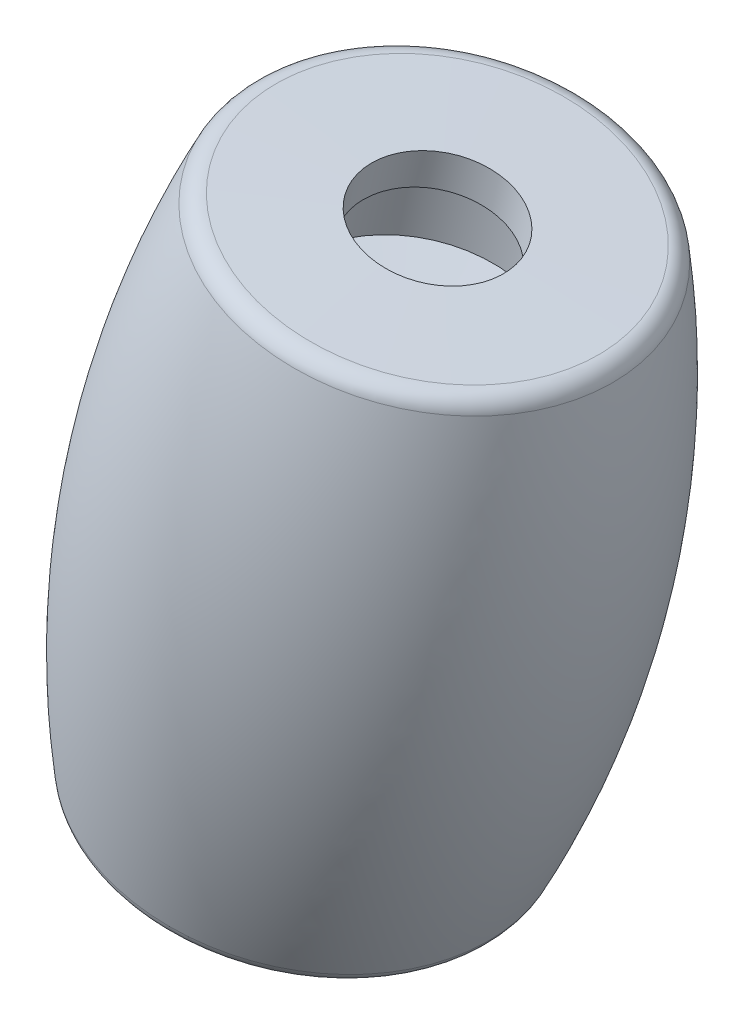
ISO-10303-21;
HEADER;
FILE_DESCRIPTION(('STEP AP214'),'2;1');
FILE_NAME('part.step','',(''),(''),'','','');
FILE_SCHEMA(('AUTOMOTIVE_DESIGN { 1 0 10303 214 1 1 1 1 }'));
ENDSEC;
DATA;
#1=APPLICATION_CONTEXT('core data for automotive mechanical design processes');
#2=APPLICATION_PROTOCOL_DEFINITION('international standard','automotive_design',2000,#1);
#3=PRODUCT_CONTEXT('',#1,'mechanical');
#4=PRODUCT('Part','Part','',(#3));
#5=PRODUCT_RELATED_PRODUCT_CATEGORY('part','',(#4));
#6=PRODUCT_DEFINITION_FORMATION('','',#4);
#7=PRODUCT_DEFINITION_CONTEXT('part definition',#1,'design');
#8=PRODUCT_DEFINITION('design','',#6,#7);
#9=PRODUCT_DEFINITION_SHAPE('','',#8);
#10=(LENGTH_UNIT() NAMED_UNIT(*) SI_UNIT(.MILLI.,.METRE.));
#11=(NAMED_UNIT(*) PLANE_ANGLE_UNIT() SI_UNIT($,.RADIAN.));
#12=(NAMED_UNIT(*) SI_UNIT($,.STERADIAN.) SOLID_ANGLE_UNIT());
#13=UNCERTAINTY_MEASURE_WITH_UNIT(LENGTH_MEASURE(1.E-05),#10,'distance_accuracy_value','');
#14=(GEOMETRIC_REPRESENTATION_CONTEXT(3) GLOBAL_UNCERTAINTY_ASSIGNED_CONTEXT((#13)) GLOBAL_UNIT_ASSIGNED_CONTEXT((#10,
#11,#12)) REPRESENTATION_CONTEXT('',''));
#15=CARTESIAN_POINT('',(0.,0.,0.));
#16=DIRECTION('',(0.,0.,1.));
#17=DIRECTION('',(1.,0.,0.));
#18=AXIS2_PLACEMENT_3D('',#15,#16,#17);
#19=CARTESIAN_POINT('',(23.5095303593453,-4.85303845884583,0.));
#20=DIRECTION('',(-0.222520933956315,-0.974927912181824,0.));
#21=DIRECTION('',(0.974927912181824,-0.222520933956315,0.));
#22=AXIS2_PLACEMENT_3D('',#19,#20,#21);
#23=CONICAL_SURFACE('',#22,4.5000000001628,1.48352986420494);
#24=CARTESIAN_POINT('',(23.509530359342,-4.85303845886061,0.));
#25=DIRECTION('',(0.222520933956315,0.974927912181824,0.));
#26=DIRECTION('',(-0.974927912181824,0.222520933956315,0.));
#27=AXIS2_PLACEMENT_3D('',#24,#25,#26);
#28=CIRCLE('',#27,4.5);
#29=CARTESIAN_POINT('',(19.1223547545237,-3.85169425605719,0.));
#30=VERTEX_POINT('',#29);
#31=EDGE_CURVE('E20',#30,#30,#28,.F.);
#32=ORIENTED_EDGE('',*,*,#31,.T.);
#33=EDGE_LOOP('',(#32));
#34=FACE_BOUND('',#33,.T.);
#35=CARTESIAN_POINT('',(23.5387324480195,-4.72509574875425,0.));
#36=DIRECTION('',(0.222520933956315,0.974927912181824,0.));
#37=DIRECTION('',(-0.974927912181824,0.222520933956315,0.));
#38=AXIS2_PLACEMENT_3D('',#35,#36,#37);
#39=CIRCLE('',#38,3.);
#40=CARTESIAN_POINT('',(20.6139487114741,-4.0575329468853,0.));
#41=VERTEX_POINT('',#40);
#42=EDGE_CURVE('E108',#41,#41,#39,.T.);
#43=ORIENTED_EDGE('',*,*,#42,.T.);
#44=EDGE_LOOP('',(#43));
#45=FACE_BOUND('',#44,.T.);
#46=ADVANCED_FACE('F16',(#34,#45),#23,.F.);
#47=CARTESIAN_POINT('',(23.3982698923638,-5.34050241495152,0.));
#48=DIRECTION('',(0.222520933956315,0.974927912181824,0.));
#49=DIRECTION('',(-0.974927912181824,0.222520933956315,0.));
#50=AXIS2_PLACEMENT_3D('',#47,#48,#49);
#51=CYLINDRICAL_SURFACE('',#50,4.5);
#52=CARTESIAN_POINT('',(23.2870094253812,-5.82796637106183,0.));
#53=DIRECTION('',(0.222520933956315,0.974927912181824,0.));
#54=DIRECTION('',(0.783683266604705,-0.178870591591281,0.594849433981041));
#55=AXIS2_PLACEMENT_3D('',#52,#53,#54);
#56=CIRCLE('',#55,4.50000000004347);
#57=CARTESIAN_POINT('',(26.8135841251365,-6.63288403323037,2.67682245294054));
#58=VERTEX_POINT('',#57);
#59=EDGE_CURVE('E106',#58,#58,#56,.F.);
#60=ORIENTED_EDGE('',*,*,#59,.T.);
#61=EDGE_LOOP('',(#60));
#62=FACE_BOUND('',#61,.T.);
#63=ORIENTED_EDGE('',*,*,#31,.F.);
#64=EDGE_LOOP('',(#63));
#65=FACE_BOUND('',#64,.T.);
#66=ADVANCED_FACE('F116',(#62,#65),#51,.F.);
#67=CARTESIAN_POINT('',(23.8544378069742,-3.34190019497878,0.));
#68=DIRECTION('',(0.222520933956315,0.974927912181824,0.));
#69=DIRECTION('',(-0.974927912181824,0.222520933956315,0.));
#70=AXIS2_PLACEMENT_3D('',#67,#68,#69);
#71=CYLINDRICAL_SURFACE('',#70,3.);
#72=ORIENTED_EDGE('',*,*,#42,.F.);
#73=EDGE_LOOP('',(#72));
#74=FACE_BOUND('',#73,.T.);
#75=CARTESIAN_POINT('',(24.1701431659303,-1.95870464119732,0.));
#76=DIRECTION('',(0.222520933956315,0.974927912181824,0.));
#77=DIRECTION('',(0.783683266610111,-0.178870591592515,0.594849433973547));
#78=AXIS2_PLACEMENT_3D('',#75,#76,#77);
#79=CIRCLE('',#78,3.00000000003492);
#80=CARTESIAN_POINT('',(26.521192965788,-2.49531641598111,1.78454830194141));
#81=VERTEX_POINT('',#80);
#82=EDGE_CURVE('E103',#81,#81,#79,.T.);
#83=ORIENTED_EDGE('',*,*,#82,.T.);
#84=EDGE_LOOP('',(#83));
#85=FACE_BOUND('',#84,.T.);
#86=ADVANCED_FACE('F118',(#74,#85),#71,.F.);
#87=CARTESIAN_POINT('',(23.2870094253812,-5.82796637106183,0.));
#88=DIRECTION('',(0.222520933956315,0.974927912181824,0.));
#89=DIRECTION('',(-0.974927912181824,0.222520933956315,0.));
#90=AXIS2_PLACEMENT_3D('',#87,#88,#89);
#91=CONICAL_SURFACE('',#90,4.50000000004348,1.48352986421022);
#92=ORIENTED_EDGE('',*,*,#59,.F.);
#93=EDGE_LOOP('',(#92));
#94=FACE_BOUND('',#93,.T.);
#95=CARTESIAN_POINT('',(23.2578073367081,-5.95590908114879,0.));
#96=DIRECTION('',(0.222520933956315,0.974927912181824,0.));
#97=DIRECTION('',(-0.974927912181824,0.222520933956315,0.));
#98=AXIS2_PLACEMENT_3D('',#95,#96,#97);
#99=CIRCLE('',#98,3.);
#100=CARTESIAN_POINT('',(20.3330236001626,-5.28834627927985,0.));
#101=VERTEX_POINT('',#100);
#102=EDGE_CURVE('E100',#101,#101,#99,.F.);
#103=ORIENTED_EDGE('',*,*,#102,.T.);
#104=EDGE_LOOP('',(#103));
#105=FACE_BOUND('',#104,.T.);
#106=ADVANCED_FACE('F126',(#94,#105),#91,.F.);
#107=CARTESIAN_POINT('',(24.1993452546095,-1.830761931084,0.));
#108=DIRECTION('',(0.222520933956315,0.974927912181824,0.));
#109=DIRECTION('',(-0.974927912181824,0.222520933956315,0.));
#110=AXIS2_PLACEMENT_3D('',#107,#108,#109);
#111=CONICAL_SURFACE('',#110,4.50000000006729,1.48352986419233);
#112=CARTESIAN_POINT('',(24.1993452546065,-1.83076193109696,0.));
#113=DIRECTION('',(0.222520933956315,0.974927912181824,0.));
#114=DIRECTION('',(-0.974927912181824,0.222520933956315,0.));
#115=AXIS2_PLACEMENT_3D('',#112,#113,#114);
#116=CIRCLE('',#115,4.5);
#117=CARTESIAN_POINT('',(19.8121696497883,-0.829417728293538,0.));
#118=VERTEX_POINT('',#117);
#119=EDGE_CURVE('E97',#118,#118,#116,.T.);
#120=ORIENTED_EDGE('',*,*,#119,.T.);
#121=EDGE_LOOP('',(#120));
#122=FACE_BOUND('',#121,.T.);
#123=ORIENTED_EDGE('',*,*,#82,.F.);
#124=EDGE_LOOP('',(#123));
#125=FACE_BOUND('',#124,.T.);
#126=ADVANCED_FACE('F219',(#122,#125),#111,.F.);
#127=CARTESIAN_POINT('',(22.9421019777534,-7.33910463492426,0.));
#128=DIRECTION('',(0.222520933956315,0.974927912181824,0.));
#129=DIRECTION('',(-0.974927912181824,0.222520933956315,0.));
#130=AXIS2_PLACEMENT_3D('',#127,#128,#129);
#131=CYLINDRICAL_SURFACE('',#130,3.);
#132=ORIENTED_EDGE('',*,*,#102,.F.);
#133=EDGE_LOOP('',(#132));
#134=FACE_BOUND('',#133,.T.);
#135=CARTESIAN_POINT('',(22.6263966187988,-8.72230018869918,0.));
#136=DIRECTION('',(-0.222520933956315,-0.974927912181824,0.));
#137=DIRECTION('',(-0.783683266609235,0.178870591592315,-0.594849433974761));
#138=AXIS2_PLACEMENT_3D('',#135,#136,#137);
#139=CIRCLE('',#138,3.00000000002879);
#140=CARTESIAN_POINT('',(20.2753468189485,-8.18568841391709,-1.78454830194141));
#141=VERTEX_POINT('',#140);
#142=EDGE_CURVE('E94',#141,#141,#139,.T.);
#143=ORIENTED_EDGE('',*,*,#142,.T.);
#144=EDGE_LOOP('',(#143));
#145=FACE_BOUND('',#144,.T.);
#146=ADVANCED_FACE('F215',(#134,#145),#131,.F.);
#147=CARTESIAN_POINT('',(24.3106057215847,-1.34329797500605,0.));
#148=DIRECTION('',(0.222520933956315,0.974927912181824,0.));
#149=DIRECTION('',(-0.974927912181824,0.222520933956315,0.));
#150=AXIS2_PLACEMENT_3D('',#147,#148,#149);
#151=CYLINDRICAL_SURFACE('',#150,4.5);
#152=CARTESIAN_POINT('',(24.4218661885656,-0.855834018902945,0.));
#153=DIRECTION('',(-0.222520933956315,-0.974927912181824,0.));
#154=DIRECTION('',(-0.783683266614044,0.178870591593412,-0.594849433968095));
#155=AXIS2_PLACEMENT_3D('',#152,#153,#154);
#156=CIRCLE('',#155,4.49999999995028);
#157=CARTESIAN_POINT('',(20.8952914888414,-0.0509163567414816,-2.67682245282685));
#158=VERTEX_POINT('',#157);
#159=EDGE_CURVE('E91',#158,#158,#156,.F.);
#160=ORIENTED_EDGE('',*,*,#159,.T.);
#161=EDGE_LOOP('',(#160));
#162=FACE_BOUND('',#161,.T.);
#163=ORIENTED_EDGE('',*,*,#119,.F.);
#164=EDGE_LOOP('',(#163));
#165=FACE_BOUND('',#164,.T.);
#166=ADVANCED_FACE('F211',(#162,#165),#151,.F.);
#167=CARTESIAN_POINT('',(22.5971945301221,-8.85024289880135,0.));
#168=DIRECTION('',(-0.222520933956315,-0.974927912181824,0.));
#169=DIRECTION('',(0.974927912181824,-0.222520933956315,0.));
#170=AXIS2_PLACEMENT_3D('',#167,#168,#169);
#171=CONICAL_SURFACE('',#170,4.49999999993571,1.48352986419233);
#172=ORIENTED_EDGE('',*,*,#142,.F.);
#173=EDGE_LOOP('',(#172));
#174=FACE_BOUND('',#173,.T.);
#175=CARTESIAN_POINT('',(22.5971945301211,-8.85024289880609,0.));
#176=DIRECTION('',(0.222520933956315,0.974927912181824,0.));
#177=DIRECTION('',(-0.974927912181824,0.222520933956315,0.));
#178=AXIS2_PLACEMENT_3D('',#175,#176,#177);
#179=CIRCLE('',#178,4.5);
#180=CARTESIAN_POINT('',(18.2100189253029,-7.84889869600267,0.));
#181=VERTEX_POINT('',#180);
#182=EDGE_CURVE('E88',#181,#181,#179,.F.);
#183=ORIENTED_EDGE('',*,*,#182,.T.);
#184=EDGE_LOOP('',(#183));
#185=FACE_BOUND('',#184,.T.);
#186=ADVANCED_FACE('F207',(#174,#185),#171,.F.);
#187=CARTESIAN_POINT('',(24.4218661885656,-0.855834018902945,0.));
#188=DIRECTION('',(-0.222520933956315,-0.974927912181824,0.));
#189=DIRECTION('',(0.974927912181824,-0.222520933956315,0.));
#190=AXIS2_PLACEMENT_3D('',#187,#188,#189);
#191=CONICAL_SURFACE('',#190,4.49999999995029,1.48352986419812);
#192=ORIENTED_EDGE('',*,*,#159,.F.);
#193=EDGE_LOOP('',(#192));
#194=FACE_BOUND('',#193,.T.);
#195=CARTESIAN_POINT('',(24.4510682772404,-0.727891308808778,0.));
#196=DIRECTION('',(0.222520933956315,0.974927912181824,0.));
#197=DIRECTION('',(-0.974927912181824,0.222520933956315,0.));
#198=AXIS2_PLACEMENT_3D('',#195,#196,#197);
#199=CIRCLE('',#198,3.);
#200=CARTESIAN_POINT('',(21.5262845406949,-0.0603285069398328,0.));
#201=VERTEX_POINT('',#200);
#202=EDGE_CURVE('E85',#201,#201,#199,.T.);
#203=ORIENTED_EDGE('',*,*,#202,.T.);
#204=EDGE_LOOP('',(#203));
#205=FACE_BOUND('',#204,.T.);
#206=ADVANCED_FACE('F203',(#194,#205),#191,.F.);
#207=CARTESIAN_POINT('',(22.4859340631429,-9.337706854897,0.));
#208=DIRECTION('',(0.222520933956315,0.974927912181824,0.));
#209=DIRECTION('',(-0.974927912181824,0.222520933956315,0.));
#210=AXIS2_PLACEMENT_3D('',#207,#208,#209);
#211=CYLINDRICAL_SURFACE('',#210,4.5);
#212=CARTESIAN_POINT('',(22.3746735961622,-9.82517081099914,0.));
#213=DIRECTION('',(0.222520933956315,0.974927912181824,0.));
#214=DIRECTION('',(0.78368326660437,-0.178870591591204,0.594849433981505));
#215=AXIS2_PLACEMENT_3D('',#212,#213,#214);
#216=CIRCLE('',#215,4.49999999994441);
#217=CARTESIAN_POINT('',(25.9012482958383,-10.6300884731496,2.6768224528837));
#218=VERTEX_POINT('',#217);
#219=EDGE_CURVE('E82',#218,#218,#216,.F.);
#220=ORIENTED_EDGE('',*,*,#219,.T.);
#221=EDGE_LOOP('',(#220));
#222=FACE_BOUND('',#221,.T.);
#223=ORIENTED_EDGE('',*,*,#182,.F.);
#224=EDGE_LOOP('',(#223));
#225=FACE_BOUND('',#224,.T.);
#226=ADVANCED_FACE('F199',(#222,#225),#211,.F.);
#227=CARTESIAN_POINT('',(24.6117730782903,-0.0237975708420879,0.));
#228=DIRECTION('',(0.222520933956315,0.974927912181824,0.));
#229=DIRECTION('',(-0.974927912181824,0.222520933956315,0.));
#230=AXIS2_PLACEMENT_3D('',#227,#228,#229);
#231=CYLINDRICAL_SURFACE('',#230,3.);
#232=ORIENTED_EDGE('',*,*,#202,.F.);
#233=EDGE_LOOP('',(#232));
#234=FACE_BOUND('',#233,.T.);
#235=CARTESIAN_POINT('',(24.7724778793409,0.680296167128091,0.));
#236=DIRECTION('',(0.222520933956315,0.974927912181824,0.));
#237=DIRECTION('',(0.783683266616735,-0.178870591594027,0.594849433964366));
#238=AXIS2_PLACEMENT_3D('',#235,#236,#237);
#239=CIRCLE('',#238,2.99999999998566);
#240=CARTESIAN_POINT('',(27.1235276791799,0.143684392348575,1.78454830188457));
#241=VERTEX_POINT('',#240);
#242=EDGE_CURVE('E79',#241,#241,#239,.T.);
#243=ORIENTED_EDGE('',*,*,#242,.T.);
#244=EDGE_LOOP('',(#243));
#245=FACE_BOUND('',#244,.T.);
#246=ADVANCED_FACE('F195',(#234,#245),#231,.F.);
#247=CARTESIAN_POINT('',(22.3746735961647,-9.82517081098798,0.));
#248=DIRECTION('',(0.222520933956315,0.974927912181824,0.));
#249=DIRECTION('',(-0.974927912181824,0.222520933956315,0.));
#250=AXIS2_PLACEMENT_3D('',#247,#248,#249);
#251=CONICAL_SURFACE('',#250,4.50000000006986,1.4835298641973);
#252=ORIENTED_EDGE('',*,*,#219,.F.);
#253=EDGE_LOOP('',(#252));
#254=FACE_BOUND('',#253,.T.);
#255=CARTESIAN_POINT('',(22.3454715074872,-9.95311352109427,0.));
#256=DIRECTION('',(0.222520933956315,0.974927912181824,0.));
#257=DIRECTION('',(-0.974927912181824,0.222520933956315,0.));
#258=AXIS2_PLACEMENT_3D('',#255,#256,#257);
#259=CIRCLE('',#258,3.);
#260=CARTESIAN_POINT('',(19.4206877709417,-9.28555071922533,0.));
#261=VERTEX_POINT('',#260);
#262=EDGE_CURVE('E76',#261,#261,#259,.F.);
#263=ORIENTED_EDGE('',*,*,#262,.T.);
#264=EDGE_LOOP('',(#263));
#265=FACE_BOUND('',#264,.T.);
#266=ADVANCED_FACE('F191',(#254,#265),#251,.F.);
#267=CARTESIAN_POINT('',(24.7890257295901,0.752797036182137,0.));
#268=DIRECTION('',(0.222520933956315,0.974927912181824,0.));
#269=DIRECTION('',(-0.974927912181824,0.222520933956315,0.));
#270=AXIS2_PLACEMENT_3D('',#267,#268,#269);
#271=CONICAL_SURFACE('',#270,3.85000000003904,1.48352986420809);
#272=CARTESIAN_POINT('',(24.7890257295908,0.752797036184877,0.));
#273=DIRECTION('',(0.222520933956315,0.974927912181824,0.));
#274=DIRECTION('',(-0.974927912181824,0.222520933956315,0.));
#275=AXIS2_PLACEMENT_3D('',#272,#273,#274);
#276=CIRCLE('',#275,3.85);
#277=CARTESIAN_POINT('',(21.0355532676907,1.60950263191669,0.));
#278=VERTEX_POINT('',#277);
#279=EDGE_CURVE('E73',#278,#278,#276,.T.);
#280=ORIENTED_EDGE('',*,*,#279,.T.);
#281=EDGE_LOOP('',(#280));
#282=FACE_BOUND('',#281,.T.);
#283=ORIENTED_EDGE('',*,*,#242,.F.);
#284=EDGE_LOOP('',(#283));
#285=FACE_BOUND('',#284,.T.);
#286=ADVANCED_FACE('F187',(#282,#285),#271,.F.);
#287=CARTESIAN_POINT('',(22.1847667064373,-10.657207259061,0.));
#288=DIRECTION('',(0.222520933956315,0.974927912181824,0.));
#289=DIRECTION('',(-0.974927912181824,0.222520933956315,0.));
#290=AXIS2_PLACEMENT_3D('',#287,#288,#289);
#291=CYLINDRICAL_SURFACE('',#290,3.);
#292=ORIENTED_EDGE('',*,*,#262,.F.);
#293=EDGE_LOOP('',(#292));
#294=FACE_BOUND('',#293,.T.);
#295=CARTESIAN_POINT('',(22.0240619053851,-11.3613009970381,0.));
#296=DIRECTION('',(-0.222520933956315,-0.974927912181824,0.));
#297=DIRECTION('',(-0.783683266624329,0.17887059159576,-0.594849433953839));
#298=AXIS2_PLACEMENT_3D('',#295,#296,#297);
#299=CIRCLE('',#298,2.99999999994318);
#300=CARTESIAN_POINT('',(19.6730121055566,-10.824689222261,-1.78454830182773));
#301=VERTEX_POINT('',#300);
#302=EDGE_CURVE('E70',#301,#301,#299,.T.);
#303=ORIENTED_EDGE('',*,*,#302,.T.);
#304=EDGE_LOOP('',(#303));
#305=FACE_BOUND('',#304,.T.);
#306=ADVANCED_FACE('F183',(#294,#305),#291,.F.);
#307=CARTESIAN_POINT('',(24.8922472369866,1.20504000905245,0.));
#308=DIRECTION('',(0.222520933956315,0.974927912181824,0.));
#309=DIRECTION('',(-0.974927912181824,0.222520933956315,0.));
#310=AXIS2_PLACEMENT_3D('',#307,#308,#309);
#311=CYLINDRICAL_SURFACE('',#310,3.85);
#312=CARTESIAN_POINT('',(24.9954687443845,1.6572829819291,0.));
#313=DIRECTION('',(-0.222520933956315,-0.974927912181824,0.));
#314=DIRECTION('',(-0.783683266615088,0.178870591593651,-0.594849433966649));
#315=AXIS2_PLACEMENT_3D('',#312,#313,#314);
#316=CIRCLE('',#315,3.85000000005601);
#317=CARTESIAN_POINT('',(21.9782881678725,2.34593475957467,-2.29017032080492));
#318=VERTEX_POINT('',#317);
#319=EDGE_CURVE('E67',#318,#318,#316,.F.);
#320=ORIENTED_EDGE('',*,*,#319,.T.);
#321=EDGE_LOOP('',(#320));
#322=FACE_BOUND('',#321,.T.);
#323=ORIENTED_EDGE('',*,*,#279,.F.);
#324=EDGE_LOOP('',(#323));
#325=FACE_BOUND('',#324,.T.);
#326=ADVANCED_FACE('F179',(#322,#325),#311,.F.);
#327=CARTESIAN_POINT('',(22.0075140551356,-11.4338018660933,0.));
#328=DIRECTION('',(-0.222520933956315,-0.974927912181824,0.));
#329=DIRECTION('',(0.974927912181824,-0.222520933956315,0.));
#330=AXIS2_PLACEMENT_3D('',#327,#328,#329);
#331=CONICAL_SURFACE('',#330,3.84999999991566,1.48352986419787);
#332=CARTESIAN_POINT('',(22.0075140551368,-11.4338018660879,0.));
#333=DIRECTION('',(0.222520933956315,0.974927912181824,0.));
#334=DIRECTION('',(-0.974927912181824,0.222520933956315,0.));
#335=AXIS2_PLACEMENT_3D('',#332,#333,#334);
#336=CIRCLE('',#335,3.85000000000001);
#337=CARTESIAN_POINT('',(18.2540415932368,-10.5770962703561,0.));
#338=VERTEX_POINT('',#337);
#339=EDGE_CURVE('E64',#338,#338,#336,.F.);
#340=ORIENTED_EDGE('',*,*,#339,.T.);
#341=EDGE_LOOP('',(#340));
#342=FACE_BOUND('',#341,.T.);
#343=ORIENTED_EDGE('',*,*,#302,.F.);
#344=EDGE_LOOP('',(#343));
#345=FACE_BOUND('',#344,.T.);
#346=ADVANCED_FACE('F175',(#342,#345),#331,.F.);
#347=CARTESIAN_POINT('',(24.9954687443845,1.6572829819291,0.));
#348=DIRECTION('',(-0.222520933956315,-0.974927912181824,0.));
#349=DIRECTION('',(0.974927912181824,-0.222520933956315,0.));
#350=AXIS2_PLACEMENT_3D('',#347,#348,#349);
#351=CONICAL_SURFACE('',#350,3.85000000005602,1.56206968054045);
#352=ORIENTED_EDGE('',*,*,#319,.F.);
#353=EDGE_LOOP('',(#352));
#354=FACE_BOUND('',#353,.T.);
#355=CARTESIAN_POINT('',(24.9993525659251,1.67429911591029,0.));
#356=DIRECTION('',(0.222520933956315,0.974927912181824,0.));
#357=DIRECTION('',(-0.974927912181824,0.222520933956315,0.));
#358=AXIS2_PLACEMENT_3D('',#355,#356,#357);
#359=CIRCLE('',#358,1.85);
#360=CARTESIAN_POINT('',(23.1957359283887,2.08596284372948,0.));
#361=VERTEX_POINT('',#360);
#362=EDGE_CURVE('E48',#361,#361,#359,.T.);
#363=ORIENTED_EDGE('',*,*,#362,.T.);
#364=EDGE_LOOP('',(#363));
#365=FACE_BOUND('',#364,.T.);
#366=ADVANCED_FACE('F168',(#354,#365),#351,.F.);
#367=CARTESIAN_POINT('',(21.8239342846229,-12.2381173936379,0.));
#368=DIRECTION('',(0.222520933956315,0.974927912181824,0.));
#369=DIRECTION('',(-0.974927912181824,0.222520933956315,0.));
#370=AXIS2_PLACEMENT_3D('',#367,#368,#369);
#371=CYLINDRICAL_SURFACE('',#370,3.85000000000001);
#372=ORIENTED_EDGE('',*,*,#339,.F.);
#373=EDGE_LOOP('',(#372));
#374=FACE_BOUND('',#373,.T.);
#375=CARTESIAN_POINT('',(21.6403545141037,-13.0424329212109,0.));
#376=DIRECTION('',(0.222520933956315,0.974927912181824,0.));
#377=DIRECTION('',(0.783683266605544,-0.178870591591472,0.594849433979877));
#378=AXIS2_PLACEMENT_3D('',#375,#376,#377);
#379=CIRCLE('',#378,3.84999999997041);
#380=CARTESIAN_POINT('',(18.6231739382101,-12.353781143699,-2.2901703203875));
#381=VERTEX_POINT('',#380);
#382=CARTESIAN_POINT('',(24.657535090065,-13.7310846987227,2.2901703204612));
#383=VERTEX_POINT('',#382);
#384=EDGE_CURVE('E42',#381,#383,#379,.T.);
#385=ORIENTED_EDGE('',*,*,#384,.F.);
#386=CARTESIAN_POINT('',(21.6403545141037,-13.0424329212109,0.));
#387=DIRECTION('',(0.222520933956315,0.974927912181824,0.));
#388=DIRECTION('',(0.783683266605544,-0.178870591591472,0.594849433979877));
#389=AXIS2_PLACEMENT_3D('',#386,#387,#388);
#390=CIRCLE('',#389,3.84999999997041);
#391=EDGE_CURVE('E50',#383,#381,#390,.T.);
#392=ORIENTED_EDGE('',*,*,#391,.F.);
#393=EDGE_LOOP('',(#385,#392));
#394=FACE_BOUND('',#393,.T.);
#395=ADVANCED_FACE('F51',(#374,#394),#371,.F.);
#396=CARTESIAN_POINT('',(25.1106130329032,2.16176307200121,0.));
#397=DIRECTION('',(0.222520933956315,0.974927912181824,0.));
#398=DIRECTION('',(-0.974927912181824,0.222520933956315,0.));
#399=AXIS2_PLACEMENT_3D('',#396,#397,#398);
#400=CYLINDRICAL_SURFACE('',#399,1.85);
#401=ORIENTED_EDGE('',*,*,#362,.F.);
#402=EDGE_LOOP('',(#401));
#403=FACE_BOUND('',#402,.T.);
#404=CARTESIAN_POINT('',(25.2218734998813,2.64922702809163,0.));
#405=DIRECTION('',(-0.222520933956315,-0.974927912181824,0.));
#406=DIRECTION('',(-0.783683266590509,0.178870591588041,-0.594849434000717));
#407=AXIS2_PLACEMENT_3D('',#404,#405,#406);
#408=CIRCLE('',#407,1.84999999999915);
#409=CARTESIAN_POINT('',(23.7720594566895,2.98013762252936,-1.10047145290082));
#410=VERTEX_POINT('',#409);
#411=EDGE_CURVE('E53',#410,#410,#408,.T.);
#412=ORIENTED_EDGE('',*,*,#411,.F.);
#413=EDGE_LOOP('',(#412));
#414=FACE_BOUND('',#413,.T.);
#415=ADVANCED_FACE('F159',(#403,#414),#400,.F.);
#416=CARTESIAN_POINT('',(21.6416679369401,-13.0366784397743,0.));
#417=DIRECTION('',(0.222520933956315,0.974927912181824,0.));
#418=DIRECTION('',(-0.974927912181824,0.222520933956315,0.));
#419=AXIS2_PLACEMENT_3D('',#416,#417,#418);
#420=CONICAL_SURFACE('',#419,4.52635591544814,1.56206968053231);
#421=DIRECTION('',(-0.785595263181513,0.170356037719927,-0.594826783928848));
#422=VECTOR('',#421,1.);
#423=CARTESIAN_POINT('',(499000.,-108216.34666313,377809.937604698));
#424=LINE('',#423,#422);
#425=CARTESIAN_POINT('',(25.1888973260692,-13.8463104000002,2.69250025385747));
#426=VERTEX_POINT('',#425);
#427=EDGE_CURVE('E35',#426,#383,#424,.T.);
#428=ORIENTED_EDGE('',*,*,#427,.F.);
#429=CARTESIAN_POINT('',(21.6416679369424,-13.0366784397641,0.));
#430=DIRECTION('',(0.222520933956315,0.974927912181824,0.));
#431=DIRECTION('',(-0.783683266610834,0.17887059159268,-0.594849433972545));
#432=AXIS2_PLACEMENT_3D('',#429,#430,#431);
#433=CIRCLE('',#432,4.52635591341323);
#434=CARTESIAN_POINT('',(18.0944385487128,-12.227046479751,-2.6925002531754));
#435=VERTEX_POINT('',#434);
#436=EDGE_CURVE('E153',#435,#426,#433,.T.);
#437=ORIENTED_EDGE('',*,*,#436,.F.);
#438=DIRECTION('',(0.781711589530615,-0.187371523778581,0.594826783921515));
#439=VECTOR('',#438,1.);
#440=CARTESIAN_POINT('',(-496489.981670723,118997.745473983,-377809.93760004));
#441=LINE('',#440,#439);
#442=EDGE_CURVE('E47',#381,#435,#441,.F.);
#443=ORIENTED_EDGE('',*,*,#442,.F.);
#444=ORIENTED_EDGE('',*,*,#384,.T.);
#445=EDGE_LOOP('',(#428,#437,#443,#444));
#446=FACE_BOUND('',#445,.T.);
#447=ADVANCED_FACE('F45',(#446),#420,.T.);
#448=CARTESIAN_POINT('',(21.6416679369401,-13.0366784397743,0.));
#449=DIRECTION('',(0.222520933956315,0.974927912181824,0.));
#450=DIRECTION('',(-0.974927912181824,0.222520933956315,0.));
#451=AXIS2_PLACEMENT_3D('',#448,#449,#450);
#452=CONICAL_SURFACE('',#451,4.52635591544814,1.56206968056413);
#453=ORIENTED_EDGE('',*,*,#427,.T.);
#454=ORIENTED_EDGE('',*,*,#391,.T.);
#455=ORIENTED_EDGE('',*,*,#442,.T.);
#456=CARTESIAN_POINT('',(21.6416679369424,-13.0366784397641,0.));
#457=DIRECTION('',(0.222520933956315,0.974927912181824,0.));
#458=DIRECTION('',(0.783683266610834,-0.17887059159268,0.594849433972545));
#459=AXIS2_PLACEMENT_3D('',#456,#457,#458);
#460=CIRCLE('',#459,4.52635591341323);
#461=EDGE_CURVE('E58',#426,#435,#460,.T.);
#462=ORIENTED_EDGE('',*,*,#461,.F.);
#463=EDGE_LOOP('',(#453,#454,#455,#462));
#464=FACE_BOUND('',#463,.T.);
#465=ADVANCED_FACE('F56',(#464),#452,.T.);
#466=CARTESIAN_POINT('',(25.2166762555077,2.62645641268882,0.));
#467=DIRECTION('',(-0.222520933956315,-0.974927912181824,0.));
#468=DIRECTION('',(0.974927912181824,-0.222520933956315,0.));
#469=AXIS2_PLACEMENT_3D('',#466,#467,#468);
#470=CONICAL_SURFACE('',#469,4.52635591394834,1.56206968054101);
#471=CARTESIAN_POINT('',(25.2166762555042,2.62645641267326,0.));
#472=DIRECTION('',(-0.222520933956315,-0.974927912181824,0.));
#473=DIRECTION('',(0.783683266610835,-0.17887059159268,0.594849433972544));
#474=AXIS2_PLACEMENT_3D('',#471,#472,#473);
#475=CIRCLE('',#474,4.52635591396781);
#476=CARTESIAN_POINT('',(28.7639056440057,1.81682445258282,2.69250025338203));
#477=VERTEX_POINT('',#476);
#478=EDGE_CURVE('E149',#477,#477,#475,.T.);
#479=ORIENTED_EDGE('',*,*,#478,.F.);
#480=EDGE_LOOP('',(#479));
#481=FACE_BOUND('',#480,.T.);
#482=ORIENTED_EDGE('',*,*,#411,.T.);
#483=EDGE_LOOP('',(#482));
#484=FACE_BOUND('',#483,.T.);
#485=ADVANCED_FACE('F143',(#481,#484),#470,.T.);
#486=CARTESIAN_POINT('',(21.7529241674626,-12.5492330448081,0.));
#487=DIRECTION('',(0.222520933956314,0.974927912181824,0.));
#488=DIRECTION('',(-0.974927912181824,0.222520933956314,0.));
#489=AXIS2_PLACEMENT_3D('',#486,#487,#488);
#490=TOROIDAL_SURFACE('',#489,4.521992645522,0.500000000000007);
#491=CARTESIAN_POINT('',(21.7245131856192,-12.6737096894058,0.));
#492=DIRECTION('',(0.222520933956315,0.974927912181824,0.));
#493=DIRECTION('',(0.783683266610835,-0.17887059159268,0.594849433972544));
#494=AXIS2_PLACEMENT_3D('',#491,#492,#493);
#495=CIRCLE('',#494,5.0054162496834);
#496=CARTESIAN_POINT('',(25.6471741429181,-13.5690314551543,2.97746902292114));
#497=VERTEX_POINT('',#496);
#498=EDGE_CURVE('E26',#497,#497,#495,.T.);
#499=ORIENTED_EDGE('',*,*,#498,.F.);
#500=EDGE_LOOP('',(#499));
#501=FACE_BOUND('',#500,.T.);
#502=ORIENTED_EDGE('',*,*,#461,.T.);
#503=ORIENTED_EDGE('',*,*,#436,.T.);
#504=EDGE_LOOP('',(#502,#503));
#505=FACE_BOUND('',#504,.T.);
#506=ADVANCED_FACE('F138',(#501,#505),#490,.T.);
#507=CARTESIAN_POINT('',(25.105420024985,2.13901101772205,0.));
#508=DIRECTION('',(0.222520933956315,0.974927912181824,0.));
#509=DIRECTION('',(-0.974927912181824,0.222520933956315,0.));
#510=AXIS2_PLACEMENT_3D('',#507,#508,#509);
#511=TOROIDAL_SURFACE('',#510,4.521992645522,0.500000000000004);
#512=ORIENTED_EDGE('',*,*,#478,.T.);
#513=EDGE_LOOP('',(#512));
#514=FACE_BOUND('',#513,.T.);
#515=CARTESIAN_POINT('',(25.1338310068284,2.26348766231976,0.));
#516=DIRECTION('',(0.222520933956315,0.974927912181824,0.));
#517=DIRECTION('',(0.783683266610835,-0.17887059159268,0.594849433972544));
#518=AXIS2_PLACEMENT_3D('',#515,#516,#517);
#519=CIRCLE('',#518,5.0054162496834);
#520=CARTESIAN_POINT('',(29.0564919641273,1.36816589657128,2.97746902292114));
#521=VERTEX_POINT('',#520);
#522=EDGE_CURVE('E11',#521,#521,#519,.F.);
#523=ORIENTED_EDGE('',*,*,#522,.F.);
#524=EDGE_LOOP('',(#523));
#525=FACE_BOUND('',#524,.T.);
#526=ADVANCED_FACE('F18',(#514,#525),#511,.T.);
#527=CARTESIAN_POINT('',(4.6207736975637,-0.9122168153187,-14.2763864153412));
#528=DIRECTION('',(0.579935316725392,-0.132366451610955,-0.803837142027254));
#529=DIRECTION('',(0.783683266610834,-0.17887059159268,0.594849433972545));
#530=AXIS2_PLACEMENT_3D('',#527,#528,#529);
#531=CIRCLE('',#530,30.0000000000002);
#532=TRIMMED_CURVE('',#531,(PARAMETER_VALUE(-0.643501108793283)),
(PARAMETER_VALUE(0.643501108793284)),.T.,.PARAMETER.);
#533=CARTESIAN_POINT('',(23.4291720962238,-5.20511101354304,0.));
#534=DIRECTION('',(0.222520933956315,0.974927912181824,0.));
#535=AXIS1_PLACEMENT('',#533,#534);
#536=SURFACE_OF_REVOLUTION('',#532,#535);
#537=ORIENTED_EDGE('',*,*,#522,.T.);
#538=EDGE_LOOP('',(#537));
#539=FACE_BOUND('',#538,.T.);
#540=ORIENTED_EDGE('',*,*,#498,.T.);
#541=EDGE_LOOP('',(#540));
#542=FACE_BOUND('',#541,.T.);
#543=ADVANCED_FACE('F131',(#539,#542),#536,.F.);
#544=CLOSED_SHELL('',(#46,#66,#86,#106,#126,#146,#166,#186,#206,#226,#246,#266,#286,#306,#326,
#346,#366,#395,#415,#447,#465,#485,#506,#526,#543));
#545=MANIFOLD_SOLID_BREP('B1',#544);
#546=ADVANCED_BREP_SHAPE_REPRESENTATION('',(#18,#545),#14);
#547=SHAPE_DEFINITION_REPRESENTATION(#9,#546);
ENDSEC;
END-ISO-10303-21;
